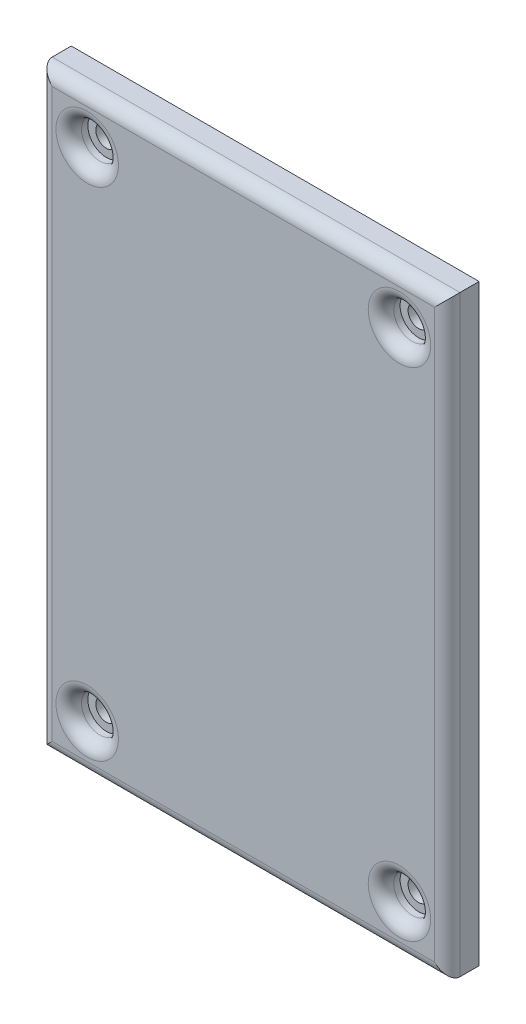
ISO-10303-21;
HEADER;
FILE_DESCRIPTION(('STEP AP214'),'2;1');
FILE_NAME('part.step','',(''),(''),'','','');
FILE_SCHEMA(('AUTOMOTIVE_DESIGN { 1 0 10303 214 1 1 1 1 }'));
ENDSEC;
DATA;
#1=APPLICATION_CONTEXT('core data for automotive mechanical design processes');
#2=APPLICATION_PROTOCOL_DEFINITION('international standard','automotive_design',2000,#1);
#3=PRODUCT_CONTEXT('',#1,'mechanical');
#4=PRODUCT('Part','Part','',(#3));
#5=PRODUCT_RELATED_PRODUCT_CATEGORY('part','',(#4));
#6=PRODUCT_DEFINITION_FORMATION('','',#4);
#7=PRODUCT_DEFINITION_CONTEXT('part definition',#1,'design');
#8=PRODUCT_DEFINITION('design','',#6,#7);
#9=PRODUCT_DEFINITION_SHAPE('','',#8);
#10=(LENGTH_UNIT() NAMED_UNIT(*) SI_UNIT(.MILLI.,.METRE.));
#11=(NAMED_UNIT(*) PLANE_ANGLE_UNIT() SI_UNIT($,.RADIAN.));
#12=(NAMED_UNIT(*) SI_UNIT($,.STERADIAN.) SOLID_ANGLE_UNIT());
#13=UNCERTAINTY_MEASURE_WITH_UNIT(LENGTH_MEASURE(1.E-05),#10,'distance_accuracy_value','');
#14=(GEOMETRIC_REPRESENTATION_CONTEXT(3) GLOBAL_UNCERTAINTY_ASSIGNED_CONTEXT((#13)) GLOBAL_UNIT_ASSIGNED_CONTEXT((#10,
#11,#12)) REPRESENTATION_CONTEXT('',''));
#15=CARTESIAN_POINT('',(0.,0.,0.));
#16=DIRECTION('',(0.,0.,1.));
#17=DIRECTION('',(1.,0.,0.));
#18=AXIS2_PLACEMENT_3D('',#15,#16,#17);
#19=CARTESIAN_POINT('',(-24.5,39.,5.));
#20=DIRECTION('',(0.,0.,-1.));
#21=DIRECTION('',(-1.,0.,0.));
#22=AXIS2_PLACEMENT_3D('',#19,#20,#21);
#23=CYLINDRICAL_SURFACE('',#22,1.65);
#24=CARTESIAN_POINT('',(-24.5,39.,0.));
#25=DIRECTION('',(0.,0.,1.));
#26=DIRECTION('',(1.,0.,0.));
#27=AXIS2_PLACEMENT_3D('',#24,#25,#26);
#28=CIRCLE('',#27,1.65);
#29=CARTESIAN_POINT('',(-22.85,39.,0.));
#30=VERTEX_POINT('',#29);
#31=EDGE_CURVE('E117',#30,#30,#28,.T.);
#32=ORIENTED_EDGE('',*,*,#31,.F.);
#33=EDGE_LOOP('',(#32));
#34=FACE_BOUND('',#33,.T.);
#35=CARTESIAN_POINT('',(-24.5,39.,2.));
#36=DIRECTION('',(0.,0.,1.));
#37=DIRECTION('',(1.,0.,0.));
#38=AXIS2_PLACEMENT_3D('',#35,#36,#37);
#39=CIRCLE('',#38,1.65);
#40=CARTESIAN_POINT('',(-22.85,39.,2.));
#41=VERTEX_POINT('',#40);
#42=EDGE_CURVE('E141',#41,#41,#39,.T.);
#43=ORIENTED_EDGE('',*,*,#42,.T.);
#44=EDGE_LOOP('',(#43));
#45=FACE_BOUND('',#44,.T.);
#46=ADVANCED_FACE('F39',(#34,#45),#23,.F.);
#47=CARTESIAN_POINT('',(24.5,-39.,5.));
#48=DIRECTION('',(0.,0.,-1.));
#49=DIRECTION('',(-1.,0.,0.));
#50=AXIS2_PLACEMENT_3D('',#47,#48,#49);
#51=CYLINDRICAL_SURFACE('',#50,1.65);
#52=CARTESIAN_POINT('',(24.5,-39.,0.));
#53=DIRECTION('',(0.,0.,1.));
#54=DIRECTION('',(1.,0.,0.));
#55=AXIS2_PLACEMENT_3D('',#52,#53,#54);
#56=CIRCLE('',#55,1.65);
#57=CARTESIAN_POINT('',(26.15,-39.,0.));
#58=VERTEX_POINT('',#57);
#59=EDGE_CURVE('E207',#58,#58,#56,.T.);
#60=ORIENTED_EDGE('',*,*,#59,.F.);
#61=EDGE_LOOP('',(#60));
#62=FACE_BOUND('',#61,.T.);
#63=CARTESIAN_POINT('',(24.5,-39.,2.));
#64=DIRECTION('',(0.,0.,1.));
#65=DIRECTION('',(1.,0.,0.));
#66=AXIS2_PLACEMENT_3D('',#63,#64,#65);
#67=CIRCLE('',#66,1.65);
#68=CARTESIAN_POINT('',(26.15,-39.,2.));
#69=VERTEX_POINT('',#68);
#70=EDGE_CURVE('E134',#69,#69,#67,.T.);
#71=ORIENTED_EDGE('',*,*,#70,.T.);
#72=EDGE_LOOP('',(#71));
#73=FACE_BOUND('',#72,.T.);
#74=ADVANCED_FACE('F234',(#62,#73),#51,.F.);
#75=CARTESIAN_POINT('',(0.,0.,5.));
#76=DIRECTION('',(0.,0.,-1.));
#77=DIRECTION('',(-1.,0.,0.));
#78=AXIS2_PLACEMENT_3D('',#75,#76,#77);
#79=PLANE('',#78);
#80=DIRECTION('',(0.,-1.,0.));
#81=VECTOR('',#80,1.);
#82=CARTESIAN_POINT('',(-30.,0.,5.));
#83=LINE('',#82,#81);
#84=CARTESIAN_POINT('',(-30.,44.5,5.));
#85=VERTEX_POINT('',#84);
#86=CARTESIAN_POINT('',(-30.,-44.5,5.));
#87=VERTEX_POINT('',#86);
#88=EDGE_CURVE('E160',#85,#87,#83,.T.);
#89=ORIENTED_EDGE('',*,*,#88,.T.);
#90=DIRECTION('',(1.,0.,0.));
#91=VECTOR('',#90,1.);
#92=CARTESIAN_POINT('',(0.,-44.5,5.));
#93=LINE('',#92,#91);
#94=CARTESIAN_POINT('',(30.,-44.5,5.));
#95=VERTEX_POINT('',#94);
#96=EDGE_CURVE('E162',#87,#95,#93,.T.);
#97=ORIENTED_EDGE('',*,*,#96,.T.);
#98=DIRECTION('',(0.,1.,0.));
#99=VECTOR('',#98,1.);
#100=CARTESIAN_POINT('',(30.,0.,5.));
#101=LINE('',#100,#99);
#102=CARTESIAN_POINT('',(30.,44.5,5.));
#103=VERTEX_POINT('',#102);
#104=EDGE_CURVE('E156',#95,#103,#101,.T.);
#105=ORIENTED_EDGE('',*,*,#104,.T.);
#106=DIRECTION('',(-1.,0.,0.));
#107=VECTOR('',#106,1.);
#108=CARTESIAN_POINT('',(0.,44.5,5.));
#109=LINE('',#108,#107);
#110=EDGE_CURVE('E158',#103,#85,#109,.T.);
#111=ORIENTED_EDGE('',*,*,#110,.T.);
#112=EDGE_LOOP('',(#89,#97,#105,#111));
#113=FACE_BOUND('',#112,.T.);
#114=CARTESIAN_POINT('',(-24.5,39.,5.));
#115=DIRECTION('',(0.,0.,-1.));
#116=DIRECTION('',(-1.,0.,0.));
#117=AXIS2_PLACEMENT_3D('',#114,#115,#116);
#118=CIRCLE('',#117,4.9);
#119=CARTESIAN_POINT('',(-29.4,39.,5.));
#120=VERTEX_POINT('',#119);
#121=EDGE_CURVE('E153',#120,#120,#118,.T.);
#122=ORIENTED_EDGE('',*,*,#121,.T.);
#123=EDGE_LOOP('',(#122));
#124=FACE_BOUND('',#123,.T.);
#125=CARTESIAN_POINT('',(24.5,39.,5.));
#126=DIRECTION('',(0.,0.,-1.));
#127=DIRECTION('',(-1.,0.,0.));
#128=AXIS2_PLACEMENT_3D('',#125,#126,#127);
#129=CIRCLE('',#128,4.9);
#130=CARTESIAN_POINT('',(19.6,39.,5.));
#131=VERTEX_POINT('',#130);
#132=EDGE_CURVE('E150',#131,#131,#129,.T.);
#133=ORIENTED_EDGE('',*,*,#132,.T.);
#134=EDGE_LOOP('',(#133));
#135=FACE_BOUND('',#134,.T.);
#136=CARTESIAN_POINT('',(24.5,-39.,5.));
#137=DIRECTION('',(0.,0.,-1.));
#138=DIRECTION('',(-1.,0.,0.));
#139=AXIS2_PLACEMENT_3D('',#136,#137,#138);
#140=CIRCLE('',#139,4.9);
#141=CARTESIAN_POINT('',(19.6,-39.,5.));
#142=VERTEX_POINT('',#141);
#143=EDGE_CURVE('E147',#142,#142,#140,.T.);
#144=ORIENTED_EDGE('',*,*,#143,.T.);
#145=EDGE_LOOP('',(#144));
#146=FACE_BOUND('',#145,.T.);
#147=CARTESIAN_POINT('',(-24.5,-39.,5.));
#148=DIRECTION('',(0.,0.,-1.));
#149=DIRECTION('',(-1.,0.,0.));
#150=AXIS2_PLACEMENT_3D('',#147,#148,#149);
#151=CIRCLE('',#150,4.9);
#152=CARTESIAN_POINT('',(-29.4,-39.,5.));
#153=VERTEX_POINT('',#152);
#154=EDGE_CURVE('E101',#153,#153,#151,.T.);
#155=ORIENTED_EDGE('',*,*,#154,.T.);
#156=EDGE_LOOP('',(#155));
#157=FACE_BOUND('',#156,.T.);
#158=ADVANCED_FACE('F239',(#113,#124,#135,#146,#157),#79,.F.);
#159=CARTESIAN_POINT('',(0.,0.,0.));
#160=DIRECTION('',(0.,0.,-1.));
#161=DIRECTION('',(-1.,0.,0.));
#162=AXIS2_PLACEMENT_3D('',#159,#160,#161);
#163=PLANE('',#162);
#164=ORIENTED_EDGE('',*,*,#59,.T.);
#165=EDGE_LOOP('',(#164));
#166=FACE_BOUND('',#165,.T.);
#167=ORIENTED_EDGE('',*,*,#31,.T.);
#168=EDGE_LOOP('',(#167));
#169=FACE_BOUND('',#168,.T.);
#170=DIRECTION('',(0.,1.,0.));
#171=VECTOR('',#170,1.);
#172=CARTESIAN_POINT('',(32.,-46.5,0.));
#173=LINE('',#172,#171);
#174=CARTESIAN_POINT('',(32.,-46.5,0.));
#175=VERTEX_POINT('',#174);
#176=CARTESIAN_POINT('',(32.,46.5,0.));
#177=VERTEX_POINT('',#176);
#178=EDGE_CURVE('E109',#175,#177,#173,.T.);
#179=ORIENTED_EDGE('',*,*,#178,.F.);
#180=DIRECTION('',(1.,0.,0.));
#181=VECTOR('',#180,1.);
#182=CARTESIAN_POINT('',(-32.,-46.5,0.));
#183=LINE('',#182,#181);
#184=CARTESIAN_POINT('',(-32.,-46.5,0.));
#185=VERTEX_POINT('',#184);
#186=EDGE_CURVE('E125',#185,#175,#183,.T.);
#187=ORIENTED_EDGE('',*,*,#186,.F.);
#188=DIRECTION('',(0.,-1.,0.));
#189=VECTOR('',#188,1.);
#190=CARTESIAN_POINT('',(-32.,-46.5,0.));
#191=LINE('',#190,#189);
#192=CARTESIAN_POINT('',(-32.,46.5,0.));
#193=VERTEX_POINT('',#192);
#194=EDGE_CURVE('E111',#193,#185,#191,.T.);
#195=ORIENTED_EDGE('',*,*,#194,.F.);
#196=DIRECTION('',(-1.,0.,0.));
#197=VECTOR('',#196,1.);
#198=CARTESIAN_POINT('',(-32.,46.5,0.));
#199=LINE('',#198,#197);
#200=EDGE_CURVE('E96',#177,#193,#199,.T.);
#201=ORIENTED_EDGE('',*,*,#200,.F.);
#202=EDGE_LOOP('',(#179,#187,#195,#201));
#203=FACE_BOUND('',#202,.T.);
#204=CARTESIAN_POINT('',(24.5,39.,0.));
#205=DIRECTION('',(0.,0.,1.));
#206=DIRECTION('',(-1.,0.,0.));
#207=AXIS2_PLACEMENT_3D('',#204,#205,#206);
#208=CIRCLE('',#207,1.65);
#209=CARTESIAN_POINT('',(22.85,39.,0.));
#210=VERTEX_POINT('',#209);
#211=EDGE_CURVE('E120',#210,#210,#208,.T.);
#212=ORIENTED_EDGE('',*,*,#211,.T.);
#213=EDGE_LOOP('',(#212));
#214=FACE_BOUND('',#213,.T.);
#215=CARTESIAN_POINT('',(-24.5,-39.,0.));
#216=DIRECTION('',(0.,0.,1.));
#217=DIRECTION('',(-1.,0.,0.));
#218=AXIS2_PLACEMENT_3D('',#215,#216,#217);
#219=CIRCLE('',#218,1.65);
#220=CARTESIAN_POINT('',(-26.15,-39.,0.));
#221=VERTEX_POINT('',#220);
#222=EDGE_CURVE('E144',#221,#221,#219,.T.);
#223=ORIENTED_EDGE('',*,*,#222,.T.);
#224=EDGE_LOOP('',(#223));
#225=FACE_BOUND('',#224,.T.);
#226=ADVANCED_FACE('F106',(#166,#169,#203,#214,#225),#163,.T.);
#227=CARTESIAN_POINT('',(32.,-46.5,5.));
#228=DIRECTION('',(-1.,0.,0.));
#229=DIRECTION('',(0.,0.,1.));
#230=AXIS2_PLACEMENT_3D('',#227,#228,#229);
#231=PLANE('',#230);
#232=DIRECTION('',(0.,0.,-1.));
#233=VECTOR('',#232,1.);
#234=CARTESIAN_POINT('',(32.,46.5,5.));
#235=LINE('',#234,#233);
#236=CARTESIAN_POINT('',(32.,46.5,3.));
#237=VERTEX_POINT('',#236);
#238=EDGE_CURVE('E93',#237,#177,#235,.T.);
#239=ORIENTED_EDGE('',*,*,#238,.F.);
#240=DIRECTION('',(0.,1.,0.));
#241=VECTOR('',#240,1.);
#242=CARTESIAN_POINT('',(32.,-46.5,3.));
#243=LINE('',#242,#241);
#244=CARTESIAN_POINT('',(32.,-46.5,3.));
#245=VERTEX_POINT('',#244);
#246=EDGE_CURVE('E170',#237,#245,#243,.F.);
#247=ORIENTED_EDGE('',*,*,#246,.T.);
#248=DIRECTION('',(0.,0.,-1.));
#249=VECTOR('',#248,1.);
#250=CARTESIAN_POINT('',(32.,-46.5,5.));
#251=LINE('',#250,#249);
#252=EDGE_CURVE('E115',#245,#175,#251,.T.);
#253=ORIENTED_EDGE('',*,*,#252,.T.);
#254=ORIENTED_EDGE('',*,*,#178,.T.);
#255=EDGE_LOOP('',(#239,#247,#253,#254));
#256=FACE_BOUND('',#255,.T.);
#257=ADVANCED_FACE('F113',(#256),#231,.F.);
#258=CARTESIAN_POINT('',(-32.,46.5,5.));
#259=DIRECTION('',(0.,-1.,0.));
#260=DIRECTION('',(0.,0.,-1.));
#261=AXIS2_PLACEMENT_3D('',#258,#259,#260);
#262=PLANE('',#261);
#263=DIRECTION('',(0.,0.,-1.));
#264=VECTOR('',#263,1.);
#265=CARTESIAN_POINT('',(-32.,46.5,5.));
#266=LINE('',#265,#264);
#267=CARTESIAN_POINT('',(-32.,46.5,3.));
#268=VERTEX_POINT('',#267);
#269=EDGE_CURVE('E102',#268,#193,#266,.T.);
#270=ORIENTED_EDGE('',*,*,#269,.F.);
#271=DIRECTION('',(-1.,0.,0.));
#272=VECTOR('',#271,1.);
#273=CARTESIAN_POINT('',(-32.,46.5,3.));
#274=LINE('',#273,#272);
#275=EDGE_CURVE('E56',#268,#237,#274,.F.);
#276=ORIENTED_EDGE('',*,*,#275,.T.);
#277=ORIENTED_EDGE('',*,*,#238,.T.);
#278=ORIENTED_EDGE('',*,*,#200,.T.);
#279=EDGE_LOOP('',(#270,#276,#277,#278));
#280=FACE_BOUND('',#279,.T.);
#281=ADVANCED_FACE('F95',(#280),#262,.F.);
#282=CARTESIAN_POINT('',(-32.,-46.5,5.));
#283=DIRECTION('',(1.,0.,0.));
#284=DIRECTION('',(0.,0.,-1.));
#285=AXIS2_PLACEMENT_3D('',#282,#283,#284);
#286=PLANE('',#285);
#287=DIRECTION('',(0.,0.,-1.));
#288=VECTOR('',#287,1.);
#289=CARTESIAN_POINT('',(-32.,-46.5,5.));
#290=LINE('',#289,#288);
#291=CARTESIAN_POINT('',(-32.,-46.5,3.));
#292=VERTEX_POINT('',#291);
#293=EDGE_CURVE('E128',#292,#185,#290,.T.);
#294=ORIENTED_EDGE('',*,*,#293,.F.);
#295=DIRECTION('',(0.,-1.,0.));
#296=VECTOR('',#295,1.);
#297=CARTESIAN_POINT('',(-32.,-46.5,3.));
#298=LINE('',#297,#296);
#299=EDGE_CURVE('E64',#292,#268,#298,.F.);
#300=ORIENTED_EDGE('',*,*,#299,.T.);
#301=ORIENTED_EDGE('',*,*,#269,.T.);
#302=ORIENTED_EDGE('',*,*,#194,.T.);
#303=EDGE_LOOP('',(#294,#300,#301,#302));
#304=FACE_BOUND('',#303,.T.);
#305=ADVANCED_FACE('F227',(#304),#286,.F.);
#306=CARTESIAN_POINT('',(-32.,-46.5,5.));
#307=DIRECTION('',(0.,1.,0.));
#308=DIRECTION('',(0.,0.,1.));
#309=AXIS2_PLACEMENT_3D('',#306,#307,#308);
#310=PLANE('',#309);
#311=ORIENTED_EDGE('',*,*,#252,.F.);
#312=DIRECTION('',(1.,0.,0.));
#313=VECTOR('',#312,1.);
#314=CARTESIAN_POINT('',(-32.,-46.5,3.));
#315=LINE('',#314,#313);
#316=EDGE_CURVE('E165',#245,#292,#315,.F.);
#317=ORIENTED_EDGE('',*,*,#316,.T.);
#318=ORIENTED_EDGE('',*,*,#293,.T.);
#319=ORIENTED_EDGE('',*,*,#186,.T.);
#320=EDGE_LOOP('',(#311,#317,#318,#319));
#321=FACE_BOUND('',#320,.T.);
#322=ADVANCED_FACE('F216',(#321),#310,.F.);
#323=CARTESIAN_POINT('',(24.5,39.,5.));
#324=DIRECTION('',(0.,0.,-1.));
#325=DIRECTION('',(-1.,0.,0.));
#326=AXIS2_PLACEMENT_3D('',#323,#324,#325);
#327=CYLINDRICAL_SURFACE('',#326,1.65);
#328=CARTESIAN_POINT('',(24.5,39.,2.));
#329=DIRECTION('',(0.,0.,-1.));
#330=DIRECTION('',(-1.,0.,0.));
#331=AXIS2_PLACEMENT_3D('',#328,#329,#330);
#332=CIRCLE('',#331,1.65);
#333=CARTESIAN_POINT('',(22.85,39.,2.));
#334=VERTEX_POINT('',#333);
#335=EDGE_CURVE('E138',#334,#334,#332,.T.);
#336=ORIENTED_EDGE('',*,*,#335,.F.);
#337=EDGE_LOOP('',(#336));
#338=FACE_BOUND('',#337,.T.);
#339=ORIENTED_EDGE('',*,*,#211,.F.);
#340=EDGE_LOOP('',(#339));
#341=FACE_BOUND('',#340,.T.);
#342=ADVANCED_FACE('F213',(#338,#341),#327,.F.);
#343=CARTESIAN_POINT('',(-24.5,-39.,5.));
#344=DIRECTION('',(0.,0.,-1.));
#345=DIRECTION('',(-1.,0.,0.));
#346=AXIS2_PLACEMENT_3D('',#343,#344,#345);
#347=CYLINDRICAL_SURFACE('',#346,1.65);
#348=CARTESIAN_POINT('',(-24.5,-39.,2.));
#349=DIRECTION('',(0.,0.,-1.));
#350=DIRECTION('',(-1.,0.,0.));
#351=AXIS2_PLACEMENT_3D('',#348,#349,#350);
#352=CIRCLE('',#351,1.65);
#353=CARTESIAN_POINT('',(-26.15,-39.,2.));
#354=VERTEX_POINT('',#353);
#355=EDGE_CURVE('E131',#354,#354,#352,.T.);
#356=ORIENTED_EDGE('',*,*,#355,.F.);
#357=EDGE_LOOP('',(#356));
#358=FACE_BOUND('',#357,.T.);
#359=ORIENTED_EDGE('',*,*,#222,.F.);
#360=EDGE_LOOP('',(#359));
#361=FACE_BOUND('',#360,.T.);
#362=ADVANCED_FACE('F215',(#358,#361),#347,.F.);
#363=CARTESIAN_POINT('',(-24.5,-39.,2.));
#364=DIRECTION('',(0.,0.,1.));
#365=DIRECTION('',(1.,0.,0.));
#366=AXIS2_PLACEMENT_3D('',#363,#364,#365);
#367=CYLINDRICAL_SURFACE('',#366,2.9);
#368=CARTESIAN_POINT('',(-24.5,-39.,3.));
#369=DIRECTION('',(0.,0.,-1.));
#370=DIRECTION('',(-1.,0.,0.));
#371=AXIS2_PLACEMENT_3D('',#368,#369,#370);
#372=CIRCLE('',#371,2.9);
#373=CARTESIAN_POINT('',(-27.4,-39.,3.));
#374=VERTEX_POINT('',#373);
#375=EDGE_CURVE('E11',#374,#374,#372,.F.);
#376=ORIENTED_EDGE('',*,*,#375,.T.);
#377=EDGE_LOOP('',(#376));
#378=FACE_BOUND('',#377,.T.);
#379=CARTESIAN_POINT('',(-24.5,-39.,2.));
#380=DIRECTION('',(0.,0.,1.));
#381=DIRECTION('',(-1.,0.,0.));
#382=AXIS2_PLACEMENT_3D('',#379,#380,#381);
#383=CIRCLE('',#382,2.9);
#384=CARTESIAN_POINT('',(-27.4,-39.,2.));
#385=VERTEX_POINT('',#384);
#386=EDGE_CURVE('E189',#385,#385,#383,.T.);
#387=ORIENTED_EDGE('',*,*,#386,.F.);
#388=EDGE_LOOP('',(#387));
#389=FACE_BOUND('',#388,.T.);
#390=ADVANCED_FACE('F223',(#378,#389),#367,.F.);
#391=CARTESIAN_POINT('',(-24.5,-39.,2.));
#392=DIRECTION('',(0.,0.,-1.));
#393=DIRECTION('',(-1.,0.,0.));
#394=AXIS2_PLACEMENT_3D('',#391,#392,#393);
#395=PLANE('',#394);
#396=ORIENTED_EDGE('',*,*,#355,.T.);
#397=EDGE_LOOP('',(#396));
#398=FACE_BOUND('',#397,.T.);
#399=ORIENTED_EDGE('',*,*,#386,.T.);
#400=EDGE_LOOP('',(#399));
#401=FACE_BOUND('',#400,.T.);
#402=ADVANCED_FACE('F292',(#398,#401),#395,.F.);
#403=CARTESIAN_POINT('',(24.5,-39.,2.));
#404=DIRECTION('',(0.,0.,1.));
#405=DIRECTION('',(1.,0.,0.));
#406=AXIS2_PLACEMENT_3D('',#403,#404,#405);
#407=CYLINDRICAL_SURFACE('',#406,2.9);
#408=CARTESIAN_POINT('',(24.5,-39.,3.));
#409=DIRECTION('',(0.,0.,-1.));
#410=DIRECTION('',(-1.,0.,0.));
#411=AXIS2_PLACEMENT_3D('',#408,#409,#410);
#412=CIRCLE('',#411,2.9);
#413=CARTESIAN_POINT('',(21.6,-39.,3.));
#414=VERTEX_POINT('',#413);
#415=EDGE_CURVE('E48',#414,#414,#412,.F.);
#416=ORIENTED_EDGE('',*,*,#415,.T.);
#417=EDGE_LOOP('',(#416));
#418=FACE_BOUND('',#417,.T.);
#419=CARTESIAN_POINT('',(24.5,-39.,2.));
#420=DIRECTION('',(0.,0.,1.));
#421=DIRECTION('',(1.,0.,0.));
#422=AXIS2_PLACEMENT_3D('',#419,#420,#421);
#423=CIRCLE('',#422,2.9);
#424=CARTESIAN_POINT('',(27.4,-39.,2.));
#425=VERTEX_POINT('',#424);
#426=EDGE_CURVE('E194',#425,#425,#423,.T.);
#427=ORIENTED_EDGE('',*,*,#426,.F.);
#428=EDGE_LOOP('',(#427));
#429=FACE_BOUND('',#428,.T.);
#430=ADVANCED_FACE('F288',(#418,#429),#407,.F.);
#431=CARTESIAN_POINT('',(24.5,-39.,2.));
#432=DIRECTION('',(0.,0.,1.));
#433=DIRECTION('',(1.,0.,0.));
#434=AXIS2_PLACEMENT_3D('',#431,#432,#433);
#435=PLANE('',#434);
#436=ORIENTED_EDGE('',*,*,#70,.F.);
#437=EDGE_LOOP('',(#436));
#438=FACE_BOUND('',#437,.T.);
#439=ORIENTED_EDGE('',*,*,#426,.T.);
#440=EDGE_LOOP('',(#439));
#441=FACE_BOUND('',#440,.T.);
#442=ADVANCED_FACE('F291',(#438,#441),#435,.T.);
#443=CARTESIAN_POINT('',(24.5,39.,2.));
#444=DIRECTION('',(0.,0.,1.));
#445=DIRECTION('',(1.,0.,0.));
#446=AXIS2_PLACEMENT_3D('',#443,#444,#445);
#447=CYLINDRICAL_SURFACE('',#446,2.9);
#448=CARTESIAN_POINT('',(24.5,39.,3.));
#449=DIRECTION('',(0.,0.,-1.));
#450=DIRECTION('',(-1.,0.,0.));
#451=AXIS2_PLACEMENT_3D('',#448,#449,#450);
#452=CIRCLE('',#451,2.9);
#453=CARTESIAN_POINT('',(21.6,39.,3.));
#454=VERTEX_POINT('',#453);
#455=EDGE_CURVE('E175',#454,#454,#452,.F.);
#456=ORIENTED_EDGE('',*,*,#455,.T.);
#457=EDGE_LOOP('',(#456));
#458=FACE_BOUND('',#457,.T.);
#459=CARTESIAN_POINT('',(24.5,39.,2.));
#460=DIRECTION('',(0.,0.,1.));
#461=DIRECTION('',(-1.,0.,0.));
#462=AXIS2_PLACEMENT_3D('',#459,#460,#461);
#463=CIRCLE('',#462,2.9);
#464=CARTESIAN_POINT('',(21.6,39.,2.));
#465=VERTEX_POINT('',#464);
#466=EDGE_CURVE('E199',#465,#465,#463,.T.);
#467=ORIENTED_EDGE('',*,*,#466,.F.);
#468=EDGE_LOOP('',(#467));
#469=FACE_BOUND('',#468,.T.);
#470=ADVANCED_FACE('F297',(#458,#469),#447,.F.);
#471=CARTESIAN_POINT('',(24.5,39.,2.));
#472=DIRECTION('',(0.,0.,-1.));
#473=DIRECTION('',(-1.,0.,0.));
#474=AXIS2_PLACEMENT_3D('',#471,#472,#473);
#475=PLANE('',#474);
#476=ORIENTED_EDGE('',*,*,#335,.T.);
#477=EDGE_LOOP('',(#476));
#478=FACE_BOUND('',#477,.T.);
#479=ORIENTED_EDGE('',*,*,#466,.T.);
#480=EDGE_LOOP('',(#479));
#481=FACE_BOUND('',#480,.T.);
#482=ADVANCED_FACE('F305',(#478,#481),#475,.F.);
#483=CARTESIAN_POINT('',(-24.5,39.,2.));
#484=DIRECTION('',(0.,0.,1.));
#485=DIRECTION('',(1.,0.,0.));
#486=AXIS2_PLACEMENT_3D('',#483,#484,#485);
#487=CYLINDRICAL_SURFACE('',#486,2.9);
#488=CARTESIAN_POINT('',(-24.5,39.,3.));
#489=DIRECTION('',(0.,0.,-1.));
#490=DIRECTION('',(-1.,0.,0.));
#491=AXIS2_PLACEMENT_3D('',#488,#489,#490);
#492=CIRCLE('',#491,2.9);
#493=CARTESIAN_POINT('',(-27.4,39.,3.));
#494=VERTEX_POINT('',#493);
#495=EDGE_CURVE('E172',#494,#494,#492,.F.);
#496=ORIENTED_EDGE('',*,*,#495,.T.);
#497=EDGE_LOOP('',(#496));
#498=FACE_BOUND('',#497,.T.);
#499=CARTESIAN_POINT('',(-24.5,39.,2.));
#500=DIRECTION('',(0.,0.,1.));
#501=DIRECTION('',(1.,0.,0.));
#502=AXIS2_PLACEMENT_3D('',#499,#500,#501);
#503=CIRCLE('',#502,2.9);
#504=CARTESIAN_POINT('',(-21.6,39.,2.));
#505=VERTEX_POINT('',#504);
#506=EDGE_CURVE('E135',#505,#505,#503,.T.);
#507=ORIENTED_EDGE('',*,*,#506,.F.);
#508=EDGE_LOOP('',(#507));
#509=FACE_BOUND('',#508,.T.);
#510=ADVANCED_FACE('F318',(#498,#509),#487,.F.);
#511=CARTESIAN_POINT('',(-24.5,39.,2.));
#512=DIRECTION('',(0.,0.,1.));
#513=DIRECTION('',(1.,0.,0.));
#514=AXIS2_PLACEMENT_3D('',#511,#512,#513);
#515=PLANE('',#514);
#516=ORIENTED_EDGE('',*,*,#42,.F.);
#517=EDGE_LOOP('',(#516));
#518=FACE_BOUND('',#517,.T.);
#519=ORIENTED_EDGE('',*,*,#506,.T.);
#520=EDGE_LOOP('',(#519));
#521=FACE_BOUND('',#520,.T.);
#522=ADVANCED_FACE('F269',(#518,#521),#515,.T.);
#523=CARTESIAN_POINT('',(0.,44.5,3.));
#524=DIRECTION('',(-1.,0.,0.));
#525=DIRECTION('',(0.,0.,1.));
#526=AXIS2_PLACEMENT_3D('',#523,#524,#525);
#527=CYLINDRICAL_SURFACE('',#526,2.);
#528=CARTESIAN_POINT('',(30.,44.5,3.));
#529=DIRECTION('',(-0.707106781186547,0.707106781186547,0.));
#530=DIRECTION('',(0.707106781186547,0.707106781186547,0.));
#531=AXIS2_PLACEMENT_3D('',#528,#529,#530);
#532=ELLIPSE('',#531,2.82842712474619,2.);
#533=EDGE_CURVE('E183',#237,#103,#532,.F.);
#534=ORIENTED_EDGE('',*,*,#533,.F.);
#535=ORIENTED_EDGE('',*,*,#275,.F.);
#536=CARTESIAN_POINT('',(-30.,44.5,3.));
#537=DIRECTION('',(-0.707106781186547,-0.707106781186547,0.));
#538=DIRECTION('',(-0.707106781186547,0.707106781186547,0.));
#539=AXIS2_PLACEMENT_3D('',#536,#537,#538);
#540=ELLIPSE('',#539,2.82842712474619,2.);
#541=EDGE_CURVE('E43',#85,#268,#540,.T.);
#542=ORIENTED_EDGE('',*,*,#541,.F.);
#543=ORIENTED_EDGE('',*,*,#110,.F.);
#544=EDGE_LOOP('',(#534,#535,#542,#543));
#545=FACE_BOUND('',#544,.T.);
#546=ADVANCED_FACE('F266',(#545),#527,.T.);
#547=CARTESIAN_POINT('',(-30.,0.,3.));
#548=DIRECTION('',(0.,-1.,0.));
#549=DIRECTION('',(0.,0.,-1.));
#550=AXIS2_PLACEMENT_3D('',#547,#548,#549);
#551=CYLINDRICAL_SURFACE('',#550,2.);
#552=ORIENTED_EDGE('',*,*,#541,.T.);
#553=ORIENTED_EDGE('',*,*,#299,.F.);
#554=CARTESIAN_POINT('',(-30.,-44.5,3.));
#555=DIRECTION('',(0.707106781186547,-0.707106781186547,0.));
#556=DIRECTION('',(-0.707106781186547,-0.707106781186547,0.));
#557=AXIS2_PLACEMENT_3D('',#554,#555,#556);
#558=ELLIPSE('',#557,2.82842712474619,2.);
#559=EDGE_CURVE('E182',#87,#292,#558,.T.);
#560=ORIENTED_EDGE('',*,*,#559,.F.);
#561=ORIENTED_EDGE('',*,*,#88,.F.);
#562=EDGE_LOOP('',(#552,#553,#560,#561));
#563=FACE_BOUND('',#562,.T.);
#564=ADVANCED_FACE('F263',(#563),#551,.T.);
#565=CARTESIAN_POINT('',(30.,0.,3.));
#566=DIRECTION('',(0.,1.,0.));
#567=DIRECTION('',(0.,0.,1.));
#568=AXIS2_PLACEMENT_3D('',#565,#566,#567);
#569=CYLINDRICAL_SURFACE('',#568,2.);
#570=ORIENTED_EDGE('',*,*,#533,.T.);
#571=ORIENTED_EDGE('',*,*,#104,.F.);
#572=CARTESIAN_POINT('',(30.,-44.5,3.));
#573=DIRECTION('',(0.707106781186547,0.707106781186547,0.));
#574=DIRECTION('',(-0.707106781186547,0.707106781186547,0.));
#575=AXIS2_PLACEMENT_3D('',#572,#573,#574);
#576=ELLIPSE('',#575,2.82842712474619,2.);
#577=EDGE_CURVE('E180',#245,#95,#576,.F.);
#578=ORIENTED_EDGE('',*,*,#577,.F.);
#579=ORIENTED_EDGE('',*,*,#246,.F.);
#580=EDGE_LOOP('',(#570,#571,#578,#579));
#581=FACE_BOUND('',#580,.T.);
#582=ADVANCED_FACE('F259',(#581),#569,.T.);
#583=CARTESIAN_POINT('',(0.,-44.5,3.));
#584=DIRECTION('',(1.,0.,0.));
#585=DIRECTION('',(0.,0.,-1.));
#586=AXIS2_PLACEMENT_3D('',#583,#584,#585);
#587=CYLINDRICAL_SURFACE('',#586,2.);
#588=ORIENTED_EDGE('',*,*,#559,.T.);
#589=ORIENTED_EDGE('',*,*,#316,.F.);
#590=ORIENTED_EDGE('',*,*,#577,.T.);
#591=ORIENTED_EDGE('',*,*,#96,.F.);
#592=EDGE_LOOP('',(#588,#589,#590,#591));
#593=FACE_BOUND('',#592,.T.);
#594=ADVANCED_FACE('F255',(#593),#587,.T.);
#595=CARTESIAN_POINT('',(-24.5,39.,3.));
#596=DIRECTION('',(0.,0.,-1.));
#597=DIRECTION('',(-1.,0.,0.));
#598=AXIS2_PLACEMENT_3D('',#595,#596,#597);
#599=TOROIDAL_SURFACE('',#598,4.9,2.);
#600=ORIENTED_EDGE('',*,*,#121,.F.);
#601=EDGE_LOOP('',(#600));
#602=FACE_BOUND('',#601,.T.);
#603=ORIENTED_EDGE('',*,*,#495,.F.);
#604=EDGE_LOOP('',(#603));
#605=FACE_BOUND('',#604,.T.);
#606=ADVANCED_FACE('F258',(#602,#605),#599,.T.);
#607=CARTESIAN_POINT('',(24.5,39.,3.));
#608=DIRECTION('',(0.,0.,-1.));
#609=DIRECTION('',(-1.,0.,0.));
#610=AXIS2_PLACEMENT_3D('',#607,#608,#609);
#611=TOROIDAL_SURFACE('',#610,4.9,2.);
#612=ORIENTED_EDGE('',*,*,#132,.F.);
#613=EDGE_LOOP('',(#612));
#614=FACE_BOUND('',#613,.T.);
#615=ORIENTED_EDGE('',*,*,#455,.F.);
#616=EDGE_LOOP('',(#615));
#617=FACE_BOUND('',#616,.T.);
#618=ADVANCED_FACE('F273',(#614,#617),#611,.T.);
#619=CARTESIAN_POINT('',(24.5,-39.,3.));
#620=DIRECTION('',(0.,0.,-1.));
#621=DIRECTION('',(-1.,0.,0.));
#622=AXIS2_PLACEMENT_3D('',#619,#620,#621);
#623=TOROIDAL_SURFACE('',#622,4.9,2.);
#624=ORIENTED_EDGE('',*,*,#143,.F.);
#625=EDGE_LOOP('',(#624));
#626=FACE_BOUND('',#625,.T.);
#627=ORIENTED_EDGE('',*,*,#415,.F.);
#628=EDGE_LOOP('',(#627));
#629=FACE_BOUND('',#628,.T.);
#630=ADVANCED_FACE('F276',(#626,#629),#623,.T.);
#631=CARTESIAN_POINT('',(-24.5,-39.,3.));
#632=DIRECTION('',(0.,0.,-1.));
#633=DIRECTION('',(-1.,0.,0.));
#634=AXIS2_PLACEMENT_3D('',#631,#632,#633);
#635=TOROIDAL_SURFACE('',#634,4.9,2.);
#636=ORIENTED_EDGE('',*,*,#154,.F.);
#637=EDGE_LOOP('',(#636));
#638=FACE_BOUND('',#637,.T.);
#639=ORIENTED_EDGE('',*,*,#375,.F.);
#640=EDGE_LOOP('',(#639));
#641=FACE_BOUND('',#640,.T.);
#642=ADVANCED_FACE('F41',(#638,#641),#635,.T.);
#643=CLOSED_SHELL('',(#46,#74,#158,#226,#257,#281,#305,#322,#342,#362,#390,#402,#430,#442,#470,
#482,#510,#522,#546,#564,#582,#594,#606,#618,#630,#642));
#644=MANIFOLD_SOLID_BREP('B2',#643);
#645=ADVANCED_BREP_SHAPE_REPRESENTATION('',(#18,#644),#14);
#646=SHAPE_DEFINITION_REPRESENTATION(#9,#645);
ENDSEC;
END-ISO-10303-21;
